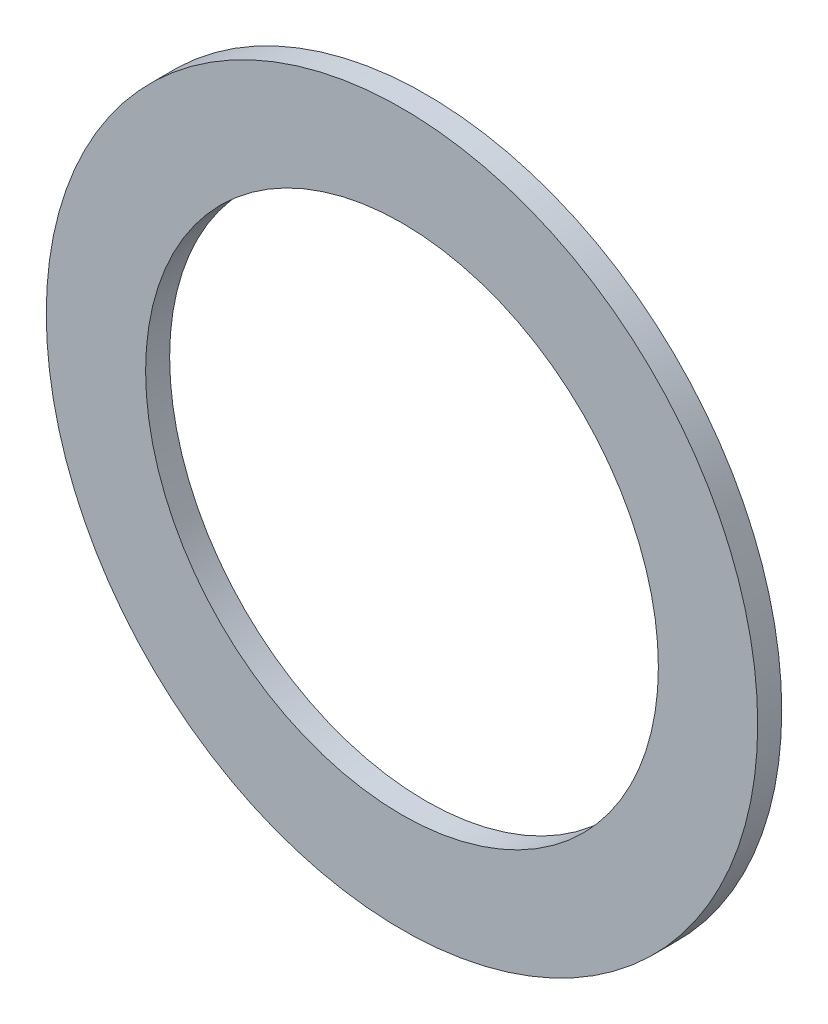
ISO-10303-21;
HEADER;
FILE_DESCRIPTION(('STEP AP214'),'2;1');
FILE_NAME('part.step','',(''),(''),'','','');
FILE_SCHEMA(('AUTOMOTIVE_DESIGN { 1 0 10303 214 1 1 1 1 }'));
ENDSEC;
DATA;
#1=APPLICATION_CONTEXT('core data for automotive mechanical design processes');
#2=APPLICATION_PROTOCOL_DEFINITION('international standard','automotive_design',2000,#1);
#3=PRODUCT_CONTEXT('',#1,'mechanical');
#4=PRODUCT('Part','Part','',(#3));
#5=PRODUCT_RELATED_PRODUCT_CATEGORY('part','',(#4));
#6=PRODUCT_DEFINITION_FORMATION('','',#4);
#7=PRODUCT_DEFINITION_CONTEXT('part definition',#1,'design');
#8=PRODUCT_DEFINITION('design','',#6,#7);
#9=PRODUCT_DEFINITION_SHAPE('','',#8);
#10=(LENGTH_UNIT() NAMED_UNIT(*) SI_UNIT(.MILLI.,.METRE.));
#11=(NAMED_UNIT(*) PLANE_ANGLE_UNIT() SI_UNIT($,.RADIAN.));
#12=(NAMED_UNIT(*) SI_UNIT($,.STERADIAN.) SOLID_ANGLE_UNIT());
#13=UNCERTAINTY_MEASURE_WITH_UNIT(LENGTH_MEASURE(1.E-05),#10,'distance_accuracy_value','');
#14=(GEOMETRIC_REPRESENTATION_CONTEXT(3) GLOBAL_UNCERTAINTY_ASSIGNED_CONTEXT((#13)) GLOBAL_UNIT_ASSIGNED_CONTEXT((#10,
#11,#12)) REPRESENTATION_CONTEXT('',''));
#15=CARTESIAN_POINT('',(0.,0.,0.));
#16=DIRECTION('',(0.,0.,1.));
#17=DIRECTION('',(1.,0.,0.));
#18=AXIS2_PLACEMENT_3D('',#15,#16,#17);
#19=CARTESIAN_POINT('',(0.,0.,16.5));
#20=DIRECTION('',(0.,0.,1.));
#21=DIRECTION('',(1.,0.,0.));
#22=AXIS2_PLACEMENT_3D('',#19,#20,#21);
#23=PLANE('',#22);
#24=CARTESIAN_POINT('',(0.,0.,16.5));
#25=DIRECTION('',(0.,0.,1.));
#26=DIRECTION('',(1.,0.,0.));
#27=AXIS2_PLACEMENT_3D('',#24,#25,#26);
#28=CIRCLE('',#27,22.2);
#29=CARTESIAN_POINT('',(22.2,0.,16.5));
#30=VERTEX_POINT('',#29);
#31=EDGE_CURVE('E10',#30,#30,#28,.T.);
#32=ORIENTED_EDGE('',*,*,#31,.T.);
#33=EDGE_LOOP('',(#32));
#34=FACE_BOUND('',#33,.T.);
#35=CARTESIAN_POINT('',(0.,0.,16.5));
#36=DIRECTION('',(0.,0.,1.));
#37=DIRECTION('',(1.,0.,0.));
#38=AXIS2_PLACEMENT_3D('',#35,#36,#37);
#39=CIRCLE('',#38,16.);
#40=CARTESIAN_POINT('',(16.,0.,16.5));
#41=VERTEX_POINT('',#40);
#42=EDGE_CURVE('E50',#41,#41,#39,.T.);
#43=ORIENTED_EDGE('',*,*,#42,.F.);
#44=EDGE_LOOP('',(#43));
#45=FACE_BOUND('',#44,.T.);
#46=ADVANCED_FACE('F36',(#34,#45),#23,.T.);
#47=CARTESIAN_POINT('',(0.,0.,15.));
#48=DIRECTION('',(0.,0.,1.));
#49=DIRECTION('',(1.,0.,0.));
#50=AXIS2_PLACEMENT_3D('',#47,#48,#49);
#51=PLANE('',#50);
#52=CARTESIAN_POINT('',(0.,0.,15.));
#53=DIRECTION('',(0.,0.,1.));
#54=DIRECTION('',(1.,0.,0.));
#55=AXIS2_PLACEMENT_3D('',#52,#53,#54);
#56=CIRCLE('',#55,22.2);
#57=CARTESIAN_POINT('',(22.2,0.,15.));
#58=VERTEX_POINT('',#57);
#59=EDGE_CURVE('E40',#58,#58,#56,.T.);
#60=ORIENTED_EDGE('',*,*,#59,.F.);
#61=EDGE_LOOP('',(#60));
#62=FACE_BOUND('',#61,.T.);
#63=CARTESIAN_POINT('',(0.,0.,15.));
#64=DIRECTION('',(0.,0.,1.));
#65=DIRECTION('',(1.,0.,0.));
#66=AXIS2_PLACEMENT_3D('',#63,#64,#65);
#67=CIRCLE('',#66,16.);
#68=CARTESIAN_POINT('',(16.,0.,15.));
#69=VERTEX_POINT('',#68);
#70=EDGE_CURVE('E52',#69,#69,#67,.T.);
#71=ORIENTED_EDGE('',*,*,#70,.T.);
#72=EDGE_LOOP('',(#71));
#73=FACE_BOUND('',#72,.T.);
#74=ADVANCED_FACE('F63',(#62,#73),#51,.F.);
#75=CARTESIAN_POINT('',(0.,0.,16.5));
#76=DIRECTION('',(0.,0.,-1.));
#77=DIRECTION('',(-1.,0.,0.));
#78=AXIS2_PLACEMENT_3D('',#75,#76,#77);
#79=CYLINDRICAL_SURFACE('',#78,22.2);
#80=ORIENTED_EDGE('',*,*,#31,.F.);
#81=EDGE_LOOP('',(#80));
#82=FACE_BOUND('',#81,.T.);
#83=ORIENTED_EDGE('',*,*,#59,.T.);
#84=EDGE_LOOP('',(#83));
#85=FACE_BOUND('',#84,.T.);
#86=ADVANCED_FACE('F38',(#82,#85),#79,.T.);
#87=CARTESIAN_POINT('',(0.,0.,16.5));
#88=DIRECTION('',(0.,0.,-1.));
#89=DIRECTION('',(-1.,0.,0.));
#90=AXIS2_PLACEMENT_3D('',#87,#88,#89);
#91=CYLINDRICAL_SURFACE('',#90,16.);
#92=ORIENTED_EDGE('',*,*,#42,.T.);
#93=EDGE_LOOP('',(#92));
#94=FACE_BOUND('',#93,.T.);
#95=ORIENTED_EDGE('',*,*,#70,.F.);
#96=EDGE_LOOP('',(#95));
#97=FACE_BOUND('',#96,.T.);
#98=ADVANCED_FACE('F59',(#94,#97),#91,.F.);
#99=CLOSED_SHELL('',(#46,#74,#86,#98));
#100=MANIFOLD_SOLID_BREP('B2',#99);
#101=ADVANCED_BREP_SHAPE_REPRESENTATION('',(#18,#100),#14);
#102=SHAPE_DEFINITION_REPRESENTATION(#9,#101);
ENDSEC;
END-ISO-10303-21;
